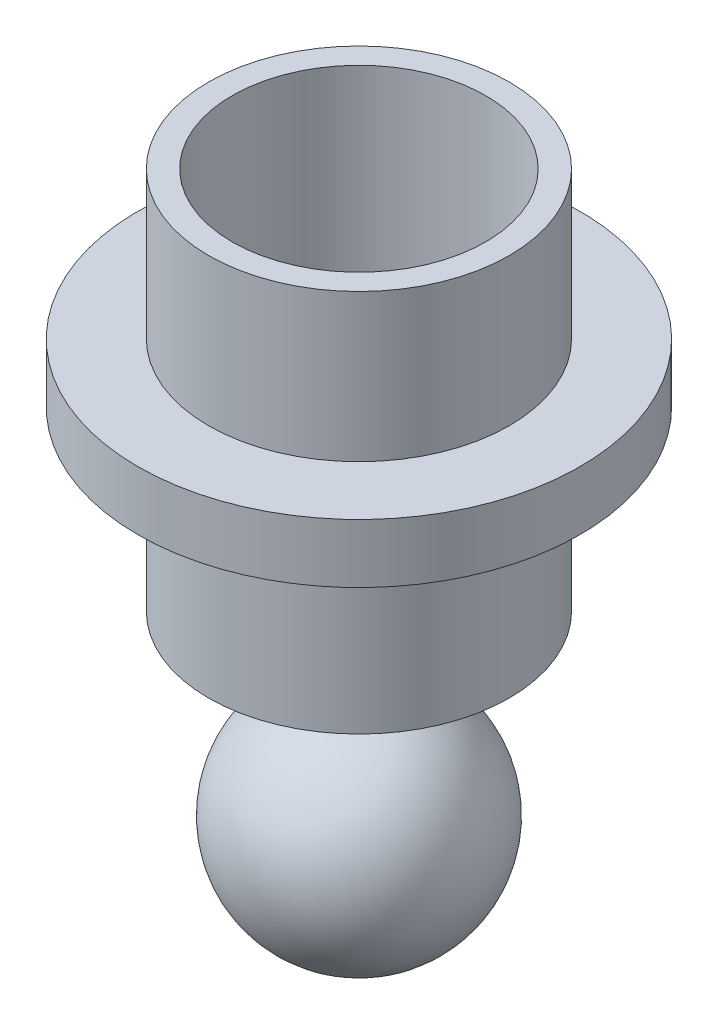
ISO-10303-21;
HEADER;
FILE_DESCRIPTION(('STEP AP214'),'2;1');
FILE_NAME('part.step','',(''),(''),'','','');
FILE_SCHEMA(('AUTOMOTIVE_DESIGN { 1 0 10303 214 1 1 1 1 }'));
ENDSEC;
DATA;
#1=APPLICATION_CONTEXT('core data for automotive mechanical design processes');
#2=APPLICATION_PROTOCOL_DEFINITION('international standard','automotive_design',2000,#1);
#3=PRODUCT_CONTEXT('',#1,'mechanical');
#4=PRODUCT('Part','Part','',(#3));
#5=PRODUCT_RELATED_PRODUCT_CATEGORY('part','',(#4));
#6=PRODUCT_DEFINITION_FORMATION('','',#4);
#7=PRODUCT_DEFINITION_CONTEXT('part definition',#1,'design');
#8=PRODUCT_DEFINITION('design','',#6,#7);
#9=PRODUCT_DEFINITION_SHAPE('','',#8);
#10=(LENGTH_UNIT() NAMED_UNIT(*) SI_UNIT(.MILLI.,.METRE.));
#11=(NAMED_UNIT(*) PLANE_ANGLE_UNIT() SI_UNIT($,.RADIAN.));
#12=(NAMED_UNIT(*) SI_UNIT($,.STERADIAN.) SOLID_ANGLE_UNIT());
#13=UNCERTAINTY_MEASURE_WITH_UNIT(LENGTH_MEASURE(1.E-05),#10,'distance_accuracy_value','');
#14=(GEOMETRIC_REPRESENTATION_CONTEXT(3) GLOBAL_UNCERTAINTY_ASSIGNED_CONTEXT((#13)) GLOBAL_UNIT_ASSIGNED_CONTEXT((#10,
#11,#12)) REPRESENTATION_CONTEXT('',''));
#15=CARTESIAN_POINT('',(0.,0.,0.));
#16=DIRECTION('',(0.,0.,1.));
#17=DIRECTION('',(1.,0.,0.));
#18=AXIS2_PLACEMENT_3D('',#15,#16,#17);
#19=CARTESIAN_POINT('',(0.,1.,0.));
#20=DIRECTION('',(0.,-1.,0.));
#21=DIRECTION('',(0.,0.,-1.));
#22=AXIS2_PLACEMENT_3D('',#19,#20,#21);
#23=CYLINDRICAL_SURFACE('',#22,5.1);
#24=CARTESIAN_POINT('',(0.,0.,0.));
#25=DIRECTION('',(0.,1.,0.));
#26=DIRECTION('',(0.,0.,1.));
#27=AXIS2_PLACEMENT_3D('',#24,#25,#26);
#28=CIRCLE('',#27,5.1);
#29=CARTESIAN_POINT('',(0.,0.,5.1));
#30=VERTEX_POINT('',#29);
#31=EDGE_CURVE('E478',#30,#30,#28,.T.);
#32=ORIENTED_EDGE('',*,*,#31,.T.);
#33=EDGE_LOOP('',(#32));
#34=FACE_BOUND('',#33,.T.);
#35=CARTESIAN_POINT('',(0.,6.,0.));
#36=DIRECTION('',(0.,1.,0.));
#37=DIRECTION('',(0.,0.,1.));
#38=AXIS2_PLACEMENT_3D('',#35,#36,#37);
#39=CIRCLE('',#38,5.1);
#40=CARTESIAN_POINT('',(0.,6.,5.1));
#41=VERTEX_POINT('',#40);
#42=EDGE_CURVE('E11',#41,#41,#39,.T.);
#43=ORIENTED_EDGE('',*,*,#42,.F.);
#44=EDGE_LOOP('',(#43));
#45=FACE_BOUND('',#44,.T.);
#46=ADVANCED_FACE('F47',(#34,#45),#23,.T.);
#47=CARTESIAN_POINT('',(0.,0.,0.));
#48=DIRECTION('',(0.,1.,0.));
#49=DIRECTION('',(0.,0.,1.));
#50=AXIS2_PLACEMENT_3D('',#47,#48,#49);
#51=PLANE('',#50);
#52=CARTESIAN_POINT('',(0.,0.,0.));
#53=DIRECTION('',(0.,1.,0.));
#54=DIRECTION('',(0.,0.,1.));
#55=AXIS2_PLACEMENT_3D('',#52,#53,#54);
#56=CIRCLE('',#55,1.5);
#57=CARTESIAN_POINT('',(0.,0.,1.5));
#58=VERTEX_POINT('',#57);
#59=EDGE_CURVE('E830',#58,#58,#56,.T.);
#60=ORIENTED_EDGE('',*,*,#59,.T.);
#61=EDGE_LOOP('',(#60));
#62=FACE_BOUND('',#61,.T.);
#63=CARTESIAN_POINT('',(0.,0.,0.));
#64=DIRECTION('',(0.,1.,0.));
#65=DIRECTION('',(0.,0.,1.));
#66=AXIS2_PLACEMENT_3D('',#63,#64,#65);
#67=CIRCLE('',#66,2.5);
#68=CARTESIAN_POINT('',(-2.41481456572267,0.,0.647047612756302));
#69=VERTEX_POINT('',#68);
#70=CARTESIAN_POINT('',(-1.76776695296637,0.,1.76776695296637));
#71=VERTEX_POINT('',#70);
#72=EDGE_CURVE('E369',#69,#71,#67,.T.);
#73=ORIENTED_EDGE('',*,*,#72,.F.);
#74=DIRECTION('',(0.965925826289068,0.,-0.258819045102521));
#75=VECTOR('',#74,1.);
#76=CARTESIAN_POINT('',(0.,0.,0.));
#77=LINE('',#76,#75);
#78=CARTESIAN_POINT('',(-3.18755522675393,0.,0.854102848838318));
#79=VERTEX_POINT('',#78);
#80=EDGE_CURVE('E385',#79,#69,#77,.T.);
#81=ORIENTED_EDGE('',*,*,#80,.F.);
#82=CARTESIAN_POINT('',(0.,0.,0.));
#83=DIRECTION('',(0.,1.,0.));
#84=DIRECTION('',(0.,0.,1.));
#85=AXIS2_PLACEMENT_3D('',#82,#83,#84);
#86=CIRCLE('',#85,3.3);
#87=CARTESIAN_POINT('',(-2.3334523779156,0.,2.33345237791561));
#88=VERTEX_POINT('',#87);
#89=EDGE_CURVE('E71',#79,#88,#86,.T.);
#90=ORIENTED_EDGE('',*,*,#89,.T.);
#91=DIRECTION('',(0.707106781186547,0.,-0.707106781186548));
#92=VECTOR('',#91,1.);
#93=CARTESIAN_POINT('',(0.,0.,0.));
#94=LINE('',#93,#92);
#95=EDGE_CURVE('E353',#88,#71,#94,.T.);
#96=ORIENTED_EDGE('',*,*,#95,.T.);
#97=EDGE_LOOP('',(#73,#81,#90,#96));
#98=FACE_BOUND('',#97,.T.);
#99=CARTESIAN_POINT('',(0.,0.,0.));
#100=DIRECTION('',(0.,1.,0.));
#101=DIRECTION('',(0.,0.,1.));
#102=AXIS2_PLACEMENT_3D('',#99,#100,#101);
#103=CIRCLE('',#102,2.5);
#104=CARTESIAN_POINT('',(1.76776695296637,0.,1.76776695296637));
#105=VERTEX_POINT('',#104);
#106=CARTESIAN_POINT('',(2.41481456572267,0.,0.647047612756299));
#107=VERTEX_POINT('',#106);
#108=EDGE_CURVE('E283',#105,#107,#103,.T.);
#109=ORIENTED_EDGE('',*,*,#108,.F.);
#110=DIRECTION('',(-0.707106781186548,0.,-0.707106781186547));
#111=VECTOR('',#110,1.);
#112=CARTESIAN_POINT('',(0.,0.,0.));
#113=LINE('',#112,#111);
#114=CARTESIAN_POINT('',(2.33345237791561,0.,2.33345237791561));
#115=VERTEX_POINT('',#114);
#116=EDGE_CURVE('E301',#115,#105,#113,.T.);
#117=ORIENTED_EDGE('',*,*,#116,.F.);
#118=CARTESIAN_POINT('',(0.,0.,0.));
#119=DIRECTION('',(0.,1.,0.));
#120=DIRECTION('',(0.,0.,1.));
#121=AXIS2_PLACEMENT_3D('',#118,#119,#120);
#122=CIRCLE('',#121,3.3);
#123=CARTESIAN_POINT('',(3.18755522675393,0.,0.854102848838315));
#124=VERTEX_POINT('',#123);
#125=EDGE_CURVE('E297',#115,#124,#122,.T.);
#126=ORIENTED_EDGE('',*,*,#125,.T.);
#127=DIRECTION('',(-0.965925826289069,0.,-0.258819045102519));
#128=VECTOR('',#127,1.);
#129=CARTESIAN_POINT('',(0.,0.,0.));
#130=LINE('',#129,#128);
#131=EDGE_CURVE('E267',#124,#107,#130,.T.);
#132=ORIENTED_EDGE('',*,*,#131,.T.);
#133=EDGE_LOOP('',(#109,#117,#126,#132));
#134=FACE_BOUND('',#133,.T.);
#135=CARTESIAN_POINT('',(0.,0.,0.));
#136=DIRECTION('',(0.,1.,0.));
#137=DIRECTION('',(0.,0.,1.));
#138=AXIS2_PLACEMENT_3D('',#135,#136,#137);
#139=CIRCLE('',#138,2.5);
#140=CARTESIAN_POINT('',(-1.76776695296637,0.,-1.76776695296637));
#141=VERTEX_POINT('',#140);
#142=CARTESIAN_POINT('',(-2.41481456572267,0.,-0.647047612756298));
#143=VERTEX_POINT('',#142);
#144=EDGE_CURVE('E432',#141,#143,#139,.T.);
#145=ORIENTED_EDGE('',*,*,#144,.F.);
#146=DIRECTION('',(0.707106781186548,0.,0.707106781186547));
#147=VECTOR('',#146,1.);
#148=CARTESIAN_POINT('',(0.,0.,0.));
#149=LINE('',#148,#147);
#150=CARTESIAN_POINT('',(-2.33345237791561,0.,-2.33345237791561));
#151=VERTEX_POINT('',#150);
#152=EDGE_CURVE('E435',#151,#141,#149,.T.);
#153=ORIENTED_EDGE('',*,*,#152,.F.);
#154=CARTESIAN_POINT('',(0.,0.,0.));
#155=DIRECTION('',(0.,1.,0.));
#156=DIRECTION('',(0.,0.,1.));
#157=AXIS2_PLACEMENT_3D('',#154,#155,#156);
#158=CIRCLE('',#157,3.3);
#159=CARTESIAN_POINT('',(-3.18755522675393,0.,-0.854102848838313));
#160=VERTEX_POINT('',#159);
#161=EDGE_CURVE('E439',#151,#160,#158,.T.);
#162=ORIENTED_EDGE('',*,*,#161,.T.);
#163=DIRECTION('',(0.965925826289069,0.,0.258819045102519));
#164=VECTOR('',#163,1.);
#165=CARTESIAN_POINT('',(0.,0.,0.));
#166=LINE('',#165,#164);
#167=EDGE_CURVE('E443',#160,#143,#166,.T.);
#168=ORIENTED_EDGE('',*,*,#167,.T.);
#169=EDGE_LOOP('',(#145,#153,#162,#168));
#170=FACE_BOUND('',#169,.T.);
#171=ORIENTED_EDGE('',*,*,#31,.F.);
#172=EDGE_LOOP('',(#171));
#173=FACE_BOUND('',#172,.T.);
#174=CARTESIAN_POINT('',(0.,0.,0.));
#175=DIRECTION('',(0.,1.,0.));
#176=DIRECTION('',(0.,0.,1.));
#177=AXIS2_PLACEMENT_3D('',#174,#175,#176);
#178=CIRCLE('',#177,2.5);
#179=CARTESIAN_POINT('',(2.41481456572267,0.,-0.647047612756301));
#180=VERTEX_POINT('',#179);
#181=CARTESIAN_POINT('',(1.76776695296637,0.,-1.76776695296637));
#182=VERTEX_POINT('',#181);
#183=EDGE_CURVE('E217',#180,#182,#178,.T.);
#184=ORIENTED_EDGE('',*,*,#183,.F.);
#185=DIRECTION('',(-0.965925826289068,0.,0.25881904510252));
#186=VECTOR('',#185,1.);
#187=CARTESIAN_POINT('',(0.,0.,0.));
#188=LINE('',#187,#186);
#189=CARTESIAN_POINT('',(3.18755522675393,0.,-0.854102848838317));
#190=VERTEX_POINT('',#189);
#191=EDGE_CURVE('E258',#190,#180,#188,.T.);
#192=ORIENTED_EDGE('',*,*,#191,.F.);
#193=CARTESIAN_POINT('',(0.,0.,0.));
#194=DIRECTION('',(0.,1.,0.));
#195=DIRECTION('',(0.,0.,1.));
#196=AXIS2_PLACEMENT_3D('',#193,#194,#195);
#197=CIRCLE('',#196,3.3);
#198=CARTESIAN_POINT('',(2.3334523779156,0.,-2.33345237791561));
#199=VERTEX_POINT('',#198);
#200=EDGE_CURVE('E253',#190,#199,#197,.T.);
#201=ORIENTED_EDGE('',*,*,#200,.T.);
#202=DIRECTION('',(-0.707106781186547,0.,0.707106781186548));
#203=VECTOR('',#202,1.);
#204=CARTESIAN_POINT('',(0.,0.,0.));
#205=LINE('',#204,#203);
#206=EDGE_CURVE('E250',#199,#182,#205,.T.);
#207=ORIENTED_EDGE('',*,*,#206,.T.);
#208=EDGE_LOOP('',(#184,#192,#201,#207));
#209=FACE_BOUND('',#208,.T.);
#210=CARTESIAN_POINT('',(0.,0.,0.));
#211=DIRECTION('',(0.,1.,0.));
#212=DIRECTION('',(0.,0.,1.));
#213=AXIS2_PLACEMENT_3D('',#210,#211,#212);
#214=CIRCLE('',#213,2.5);
#215=CARTESIAN_POINT('',(-0.647047612756303,0.,2.41481456572267));
#216=VERTEX_POINT('',#215);
#217=CARTESIAN_POINT('',(0.647047612756304,0.,2.41481456572267));
#218=VERTEX_POINT('',#217);
#219=EDGE_CURVE('E326',#216,#218,#214,.T.);
#220=ORIENTED_EDGE('',*,*,#219,.F.);
#221=DIRECTION('',(0.258819045102521,0.,-0.965925826289068));
#222=VECTOR('',#221,1.);
#223=CARTESIAN_POINT('',(0.,0.,0.));
#224=LINE('',#223,#222);
#225=CARTESIAN_POINT('',(-0.85410284883832,0.,3.18755522675393));
#226=VERTEX_POINT('',#225);
#227=EDGE_CURVE('E344',#226,#216,#224,.T.);
#228=ORIENTED_EDGE('',*,*,#227,.F.);
#229=CARTESIAN_POINT('',(0.,0.,0.));
#230=DIRECTION('',(0.,1.,0.));
#231=DIRECTION('',(0.,0.,1.));
#232=AXIS2_PLACEMENT_3D('',#229,#230,#231);
#233=CIRCLE('',#232,3.3);
#234=CARTESIAN_POINT('',(0.854102848838322,0.,3.18755522675392));
#235=VERTEX_POINT('',#234);
#236=EDGE_CURVE('E340',#226,#235,#233,.T.);
#237=ORIENTED_EDGE('',*,*,#236,.T.);
#238=DIRECTION('',(-0.258819045102522,0.,-0.965925826289068));
#239=VECTOR('',#238,1.);
#240=CARTESIAN_POINT('',(0.,0.,0.));
#241=LINE('',#240,#239);
#242=EDGE_CURVE('E310',#235,#218,#241,.T.);
#243=ORIENTED_EDGE('',*,*,#242,.T.);
#244=EDGE_LOOP('',(#220,#228,#237,#243));
#245=FACE_BOUND('',#244,.T.);
#246=DIRECTION('',(-0.258819045102521,0.,0.965925826289068));
#247=VECTOR('',#246,1.);
#248=CARTESIAN_POINT('',(0.854102848838321,0.,-3.18755522675393));
#249=LINE('',#248,#247);
#250=CARTESIAN_POINT('',(0.854102848838321,0.,-3.18755522675392));
#251=VERTEX_POINT('',#250);
#252=CARTESIAN_POINT('',(0.647047612756304,0.,-2.41481456572267));
#253=VERTEX_POINT('',#252);
#254=EDGE_CURVE('E411',#251,#253,#249,.T.);
#255=ORIENTED_EDGE('',*,*,#254,.F.);
#256=CARTESIAN_POINT('',(0.,0.,0.));
#257=DIRECTION('',(0.,1.,0.));
#258=DIRECTION('',(0.,0.,1.));
#259=AXIS2_PLACEMENT_3D('',#256,#257,#258);
#260=CIRCLE('',#259,3.3);
#261=CARTESIAN_POINT('',(-0.854102848838322,0.,-3.18755522675392));
#262=VERTEX_POINT('',#261);
#263=EDGE_CURVE('E405',#251,#262,#260,.T.);
#264=ORIENTED_EDGE('',*,*,#263,.T.);
#265=DIRECTION('',(0.258819045102522,0.,0.965925826289068));
#266=VECTOR('',#265,1.);
#267=CARTESIAN_POINT('',(-0.854102848838321,0.,-3.18755522675392));
#268=LINE('',#267,#266);
#269=CARTESIAN_POINT('',(-0.647047612756304,0.,-2.41481456572267));
#270=VERTEX_POINT('',#269);
#271=EDGE_CURVE('E63',#262,#270,#268,.T.);
#272=ORIENTED_EDGE('',*,*,#271,.T.);
#273=CARTESIAN_POINT('',(0.,0.,0.));
#274=DIRECTION('',(0.,1.,0.));
#275=DIRECTION('',(0.,0.,1.));
#276=AXIS2_PLACEMENT_3D('',#273,#274,#275);
#277=CIRCLE('',#276,2.5);
#278=EDGE_CURVE('E427',#253,#270,#277,.T.);
#279=ORIENTED_EDGE('',*,*,#278,.F.);
#280=EDGE_LOOP('',(#255,#264,#272,#279));
#281=FACE_BOUND('',#280,.T.);
#282=ADVANCED_FACE('F489',(#62,#98,#134,#170,#173,#209,#245,#281),#51,.F.);
#283=CARTESIAN_POINT('',(0.,1.,0.));
#284=DIRECTION('',(0.,1.,0.));
#285=DIRECTION('',(0.,0.,1.));
#286=AXIS2_PLACEMENT_3D('',#283,#284,#285);
#287=PLANE('',#286);
#288=CARTESIAN_POINT('',(0.,1.,0.));
#289=DIRECTION('',(0.,1.,0.));
#290=DIRECTION('',(0.,0.,1.));
#291=AXIS2_PLACEMENT_3D('',#288,#289,#290);
#292=CIRCLE('',#291,4.3);
#293=CARTESIAN_POINT('',(0.,1.,4.3));
#294=VERTEX_POINT('',#293);
#295=EDGE_CURVE('E56',#294,#294,#292,.F.);
#296=ORIENTED_EDGE('',*,*,#295,.F.);
#297=EDGE_LOOP('',(#296));
#298=FACE_BOUND('',#297,.T.);
#299=DIRECTION('',(0.707106781186548,0.,0.707106781186547));
#300=VECTOR('',#299,1.);
#301=CARTESIAN_POINT('',(0.,1.,0.));
#302=LINE('',#301,#300);
#303=CARTESIAN_POINT('',(-2.33345237791561,1.,-2.33345237791561));
#304=VERTEX_POINT('',#303);
#305=CARTESIAN_POINT('',(-1.76776695296637,1.,-1.76776695296637));
#306=VERTEX_POINT('',#305);
#307=EDGE_CURVE('E245',#304,#306,#302,.T.);
#308=ORIENTED_EDGE('',*,*,#307,.T.);
#309=CARTESIAN_POINT('',(0.,1.,0.));
#310=DIRECTION('',(0.,1.,0.));
#311=DIRECTION('',(0.,0.,1.));
#312=AXIS2_PLACEMENT_3D('',#309,#310,#311);
#313=CIRCLE('',#312,2.5);
#314=CARTESIAN_POINT('',(-2.41481456572267,1.,-0.647047612756298));
#315=VERTEX_POINT('',#314);
#316=EDGE_CURVE('E240',#306,#315,#313,.T.);
#317=ORIENTED_EDGE('',*,*,#316,.T.);
#318=DIRECTION('',(0.965925826289069,0.,0.258819045102519));
#319=VECTOR('',#318,1.);
#320=CARTESIAN_POINT('',(0.,1.,0.));
#321=LINE('',#320,#319);
#322=CARTESIAN_POINT('',(-3.18755522675393,1.,-0.854102848838313));
#323=VERTEX_POINT('',#322);
#324=EDGE_CURVE('E436',#323,#315,#321,.T.);
#325=ORIENTED_EDGE('',*,*,#324,.F.);
#326=CARTESIAN_POINT('',(0.,1.,0.));
#327=DIRECTION('',(0.,1.,0.));
#328=DIRECTION('',(0.,0.,1.));
#329=AXIS2_PLACEMENT_3D('',#326,#327,#328);
#330=CIRCLE('',#329,3.3);
#331=EDGE_CURVE('E451',#304,#323,#330,.T.);
#332=ORIENTED_EDGE('',*,*,#331,.F.);
#333=EDGE_LOOP('',(#308,#317,#325,#332));
#334=FACE_BOUND('',#333,.T.);
#335=DIRECTION('',(-0.965925826289068,0.,0.25881904510252));
#336=VECTOR('',#335,1.);
#337=CARTESIAN_POINT('',(0.,1.,0.));
#338=LINE('',#337,#336);
#339=CARTESIAN_POINT('',(3.18755522675393,1.,-0.854102848838317));
#340=VERTEX_POINT('',#339);
#341=CARTESIAN_POINT('',(2.41481456572267,1.,-0.6470476127563));
#342=VERTEX_POINT('',#341);
#343=EDGE_CURVE('E238',#340,#342,#338,.T.);
#344=ORIENTED_EDGE('',*,*,#343,.T.);
#345=CARTESIAN_POINT('',(0.,1.,0.));
#346=DIRECTION('',(0.,1.,0.));
#347=DIRECTION('',(0.,0.,1.));
#348=AXIS2_PLACEMENT_3D('',#345,#346,#347);
#349=CIRCLE('',#348,2.5);
#350=CARTESIAN_POINT('',(1.76776695296637,1.,-1.76776695296637));
#351=VERTEX_POINT('',#350);
#352=EDGE_CURVE('E214',#342,#351,#349,.T.);
#353=ORIENTED_EDGE('',*,*,#352,.T.);
#354=DIRECTION('',(-0.707106781186547,0.,0.707106781186548));
#355=VECTOR('',#354,1.);
#356=CARTESIAN_POINT('',(0.,1.,0.));
#357=LINE('',#356,#355);
#358=CARTESIAN_POINT('',(2.3334523779156,1.,-2.33345237791561));
#359=VERTEX_POINT('',#358);
#360=EDGE_CURVE('E226',#359,#351,#357,.T.);
#361=ORIENTED_EDGE('',*,*,#360,.F.);
#362=CARTESIAN_POINT('',(0.,1.,0.));
#363=DIRECTION('',(0.,1.,0.));
#364=DIRECTION('',(0.,0.,1.));
#365=AXIS2_PLACEMENT_3D('',#362,#363,#364);
#366=CIRCLE('',#365,3.3);
#367=EDGE_CURVE('E232',#340,#359,#366,.T.);
#368=ORIENTED_EDGE('',*,*,#367,.F.);
#369=EDGE_LOOP('',(#344,#353,#361,#368));
#370=FACE_BOUND('',#369,.T.);
#371=DIRECTION('',(-0.707106781186548,0.,-0.707106781186547));
#372=VECTOR('',#371,1.);
#373=CARTESIAN_POINT('',(0.,1.,0.));
#374=LINE('',#373,#372);
#375=CARTESIAN_POINT('',(2.33345237791561,1.,2.33345237791561));
#376=VERTEX_POINT('',#375);
#377=CARTESIAN_POINT('',(1.76776695296637,1.,1.76776695296637));
#378=VERTEX_POINT('',#377);
#379=EDGE_CURVE('E287',#376,#378,#374,.T.);
#380=ORIENTED_EDGE('',*,*,#379,.T.);
#381=CARTESIAN_POINT('',(0.,1.,0.));
#382=DIRECTION('',(0.,1.,0.));
#383=DIRECTION('',(0.,0.,1.));
#384=AXIS2_PLACEMENT_3D('',#381,#382,#383);
#385=CIRCLE('',#384,2.5);
#386=CARTESIAN_POINT('',(2.41481456572267,1.,0.647047612756299));
#387=VERTEX_POINT('',#386);
#388=EDGE_CURVE('E223',#378,#387,#385,.T.);
#389=ORIENTED_EDGE('',*,*,#388,.T.);
#390=DIRECTION('',(-0.965925826289069,0.,-0.258819045102519));
#391=VECTOR('',#390,1.);
#392=CARTESIAN_POINT('',(0.,1.,0.));
#393=LINE('',#392,#391);
#394=CARTESIAN_POINT('',(3.18755522675393,1.,0.854102848838315));
#395=VERTEX_POINT('',#394);
#396=EDGE_CURVE('E278',#395,#387,#393,.T.);
#397=ORIENTED_EDGE('',*,*,#396,.F.);
#398=CARTESIAN_POINT('',(0.,1.,0.));
#399=DIRECTION('',(0.,1.,0.));
#400=DIRECTION('',(0.,0.,1.));
#401=AXIS2_PLACEMENT_3D('',#398,#399,#400);
#402=CIRCLE('',#401,3.3);
#403=EDGE_CURVE('E282',#376,#395,#402,.T.);
#404=ORIENTED_EDGE('',*,*,#403,.F.);
#405=EDGE_LOOP('',(#380,#389,#397,#404));
#406=FACE_BOUND('',#405,.T.);
#407=DIRECTION('',(0.258819045102521,0.,-0.965925826289068));
#408=VECTOR('',#407,1.);
#409=CARTESIAN_POINT('',(0.,1.,0.));
#410=LINE('',#409,#408);
#411=CARTESIAN_POINT('',(-0.85410284883832,1.,3.18755522675393));
#412=VERTEX_POINT('',#411);
#413=CARTESIAN_POINT('',(-0.647047612756303,1.,2.41481456572267));
#414=VERTEX_POINT('',#413);
#415=EDGE_CURVE('E330',#412,#414,#410,.T.);
#416=ORIENTED_EDGE('',*,*,#415,.T.);
#417=CARTESIAN_POINT('',(0.,1.,0.));
#418=DIRECTION('',(0.,1.,0.));
#419=DIRECTION('',(0.,0.,1.));
#420=AXIS2_PLACEMENT_3D('',#417,#418,#419);
#421=CIRCLE('',#420,2.5);
#422=CARTESIAN_POINT('',(0.647047612756304,1.,2.41481456572267));
#423=VERTEX_POINT('',#422);
#424=EDGE_CURVE('E277',#414,#423,#421,.T.);
#425=ORIENTED_EDGE('',*,*,#424,.T.);
#426=DIRECTION('',(-0.258819045102522,0.,-0.965925826289068));
#427=VECTOR('',#426,1.);
#428=CARTESIAN_POINT('',(0.,1.,0.));
#429=LINE('',#428,#427);
#430=CARTESIAN_POINT('',(0.854102848838322,1.,3.18755522675392));
#431=VERTEX_POINT('',#430);
#432=EDGE_CURVE('E321',#431,#423,#429,.T.);
#433=ORIENTED_EDGE('',*,*,#432,.F.);
#434=CARTESIAN_POINT('',(0.,1.,0.));
#435=DIRECTION('',(0.,1.,0.));
#436=DIRECTION('',(0.,0.,1.));
#437=AXIS2_PLACEMENT_3D('',#434,#435,#436);
#438=CIRCLE('',#437,3.3);
#439=EDGE_CURVE('E325',#412,#431,#438,.T.);
#440=ORIENTED_EDGE('',*,*,#439,.F.);
#441=EDGE_LOOP('',(#416,#425,#433,#440));
#442=FACE_BOUND('',#441,.T.);
#443=DIRECTION('',(0.965925826289068,0.,-0.258819045102521));
#444=VECTOR('',#443,1.);
#445=CARTESIAN_POINT('',(0.,1.,0.));
#446=LINE('',#445,#444);
#447=CARTESIAN_POINT('',(-3.18755522675393,1.,0.854102848838318));
#448=VERTEX_POINT('',#447);
#449=CARTESIAN_POINT('',(-2.41481456572267,1.,0.647047612756302));
#450=VERTEX_POINT('',#449);
#451=EDGE_CURVE('E373',#448,#450,#446,.T.);
#452=ORIENTED_EDGE('',*,*,#451,.T.);
#453=CARTESIAN_POINT('',(0.,1.,0.));
#454=DIRECTION('',(0.,1.,0.));
#455=DIRECTION('',(0.,0.,1.));
#456=AXIS2_PLACEMENT_3D('',#453,#454,#455);
#457=CIRCLE('',#456,2.5);
#458=CARTESIAN_POINT('',(-1.76776695296637,1.,1.76776695296637));
#459=VERTEX_POINT('',#458);
#460=EDGE_CURVE('E320',#450,#459,#457,.T.);
#461=ORIENTED_EDGE('',*,*,#460,.T.);
#462=DIRECTION('',(0.707106781186547,0.,-0.707106781186548));
#463=VECTOR('',#462,1.);
#464=CARTESIAN_POINT('',(0.,1.,0.));
#465=LINE('',#464,#463);
#466=CARTESIAN_POINT('',(-2.3334523779156,1.,2.33345237791561));
#467=VERTEX_POINT('',#466);
#468=EDGE_CURVE('E364',#467,#459,#465,.T.);
#469=ORIENTED_EDGE('',*,*,#468,.F.);
#470=CARTESIAN_POINT('',(0.,1.,0.));
#471=DIRECTION('',(0.,1.,0.));
#472=DIRECTION('',(0.,0.,1.));
#473=AXIS2_PLACEMENT_3D('',#470,#471,#472);
#474=CIRCLE('',#473,3.3);
#475=EDGE_CURVE('E368',#448,#467,#474,.T.);
#476=ORIENTED_EDGE('',*,*,#475,.F.);
#477=EDGE_LOOP('',(#452,#461,#469,#476));
#478=FACE_BOUND('',#477,.T.);
#479=CARTESIAN_POINT('',(0.,1.,0.));
#480=DIRECTION('',(0.,1.,0.));
#481=DIRECTION('',(0.,0.,1.));
#482=AXIS2_PLACEMENT_3D('',#479,#480,#481);
#483=CIRCLE('',#482,3.3);
#484=CARTESIAN_POINT('',(0.854102848838321,1.,-3.18755522675392));
#485=VERTEX_POINT('',#484);
#486=CARTESIAN_POINT('',(-0.854102848838321,1.,-3.18755522675392));
#487=VERTEX_POINT('',#486);
#488=EDGE_CURVE('E406',#485,#487,#483,.T.);
#489=ORIENTED_EDGE('',*,*,#488,.F.);
#490=DIRECTION('',(-0.258819045102521,0.,0.965925826289068));
#491=VECTOR('',#490,1.);
#492=CARTESIAN_POINT('',(0.854102848838321,1.,-3.18755522675393));
#493=LINE('',#492,#491);
#494=CARTESIAN_POINT('',(0.647047612756304,1.,-2.41481456572267));
#495=VERTEX_POINT('',#494);
#496=EDGE_CURVE('E363',#485,#495,#493,.T.);
#497=ORIENTED_EDGE('',*,*,#496,.T.);
#498=CARTESIAN_POINT('',(0.,1.,0.));
#499=DIRECTION('',(0.,1.,0.));
#500=DIRECTION('',(0.,0.,1.));
#501=AXIS2_PLACEMENT_3D('',#498,#499,#500);
#502=CIRCLE('',#501,2.5);
#503=CARTESIAN_POINT('',(-0.647047612756304,1.,-2.41481456572267));
#504=VERTEX_POINT('',#503);
#505=EDGE_CURVE('E415',#495,#504,#502,.T.);
#506=ORIENTED_EDGE('',*,*,#505,.T.);
#507=DIRECTION('',(0.258819045102522,0.,0.965925826289068));
#508=VECTOR('',#507,1.);
#509=CARTESIAN_POINT('',(-0.854102848838321,1.,-3.18755522675392));
#510=LINE('',#509,#508);
#511=EDGE_CURVE('E410',#487,#504,#510,.T.);
#512=ORIENTED_EDGE('',*,*,#511,.F.);
#513=EDGE_LOOP('',(#489,#497,#506,#512));
#514=FACE_BOUND('',#513,.T.);
#515=ADVANCED_FACE('F235',(#298,#334,#370,#406,#442,#478,#514),#287,.T.);
#516=CARTESIAN_POINT('',(0.,8.,0.));
#517=DIRECTION('',(0.,1.,0.));
#518=DIRECTION('',(0.,0.,1.));
#519=AXIS2_PLACEMENT_3D('',#516,#517,#518);
#520=CIRCLE('',#519,5.1);
#521=CARTESIAN_POINT('',(0.,8.,5.1));
#522=VERTEX_POINT('',#521);
#523=EDGE_CURVE('E538',#522,#522,#520,.T.);
#524=ORIENTED_EDGE('',*,*,#523,.T.);
#525=EDGE_LOOP('',(#524));
#526=FACE_BOUND('',#525,.T.);
#527=CARTESIAN_POINT('',(0.,13.,0.));
#528=DIRECTION('',(0.,1.,0.));
#529=DIRECTION('',(0.,0.,1.));
#530=AXIS2_PLACEMENT_3D('',#527,#528,#529);
#531=CIRCLE('',#530,5.1);
#532=CARTESIAN_POINT('',(0.,13.,5.1));
#533=VERTEX_POINT('',#532);
#534=EDGE_CURVE('E474',#533,#533,#531,.T.);
#535=ORIENTED_EDGE('',*,*,#534,.F.);
#536=EDGE_LOOP('',(#535));
#537=FACE_BOUND('',#536,.T.);
#538=ADVANCED_FACE('F49',(#526,#537),#23,.T.);
#539=CARTESIAN_POINT('',(0.,13.,0.));
#540=DIRECTION('',(0.,-1.,0.));
#541=DIRECTION('',(0.,0.,-1.));
#542=AXIS2_PLACEMENT_3D('',#539,#540,#541);
#543=CYLINDRICAL_SURFACE('',#542,4.3);
#544=CARTESIAN_POINT('',(0.,13.,0.));
#545=DIRECTION('',(0.,1.,0.));
#546=DIRECTION('',(0.,0.,1.));
#547=AXIS2_PLACEMENT_3D('',#544,#545,#546);
#548=CIRCLE('',#547,4.3);
#549=CARTESIAN_POINT('',(0.,13.,4.3));
#550=VERTEX_POINT('',#549);
#551=EDGE_CURVE('E461',#550,#550,#548,.T.);
#552=ORIENTED_EDGE('',*,*,#551,.T.);
#553=EDGE_LOOP('',(#552));
#554=FACE_BOUND('',#553,.T.);
#555=ORIENTED_EDGE('',*,*,#295,.T.);
#556=EDGE_LOOP('',(#555));
#557=FACE_BOUND('',#556,.T.);
#558=ADVANCED_FACE('F485',(#554,#557),#543,.F.);
#559=CARTESIAN_POINT('',(0.,13.,0.));
#560=DIRECTION('',(0.,1.,0.));
#561=DIRECTION('',(0.,0.,1.));
#562=AXIS2_PLACEMENT_3D('',#559,#560,#561);
#563=PLANE('',#562);
#564=ORIENTED_EDGE('',*,*,#551,.F.);
#565=EDGE_LOOP('',(#564));
#566=FACE_BOUND('',#565,.T.);
#567=ORIENTED_EDGE('',*,*,#534,.T.);
#568=EDGE_LOOP('',(#567));
#569=FACE_BOUND('',#568,.T.);
#570=ADVANCED_FACE('F532',(#566,#569),#563,.T.);
#571=CARTESIAN_POINT('',(0.,0.,0.));
#572=DIRECTION('',(0.,1.,0.));
#573=DIRECTION('',(0.,0.,1.));
#574=AXIS2_PLACEMENT_3D('',#571,#572,#573);
#575=CYLINDRICAL_SURFACE('',#574,2.5);
#576=ORIENTED_EDGE('',*,*,#316,.F.);
#577=DIRECTION('',(0.,1.,0.));
#578=VECTOR('',#577,1.);
#579=CARTESIAN_POINT('',(-1.76776695296637,0.,-1.76776695296637));
#580=LINE('',#579,#578);
#581=EDGE_CURVE('E446',#141,#306,#580,.T.);
#582=ORIENTED_EDGE('',*,*,#581,.F.);
#583=ORIENTED_EDGE('',*,*,#144,.T.);
#584=DIRECTION('',(0.,1.,0.));
#585=VECTOR('',#584,1.);
#586=CARTESIAN_POINT('',(-2.41481456572267,0.,-0.647047612756298));
#587=LINE('',#586,#585);
#588=EDGE_CURVE('E458',#143,#315,#587,.T.);
#589=ORIENTED_EDGE('',*,*,#588,.T.);
#590=EDGE_LOOP('',(#576,#582,#583,#589));
#591=FACE_BOUND('',#590,.T.);
#592=ADVANCED_FACE('F501',(#591),#575,.T.);
#593=CARTESIAN_POINT('',(0.,0.,0.));
#594=DIRECTION('',(-0.258819045102519,0.,0.965925826289069));
#595=DIRECTION('',(0.965925826289069,0.,0.258819045102519));
#596=AXIS2_PLACEMENT_3D('',#593,#594,#595);
#597=PLANE('',#596);
#598=ORIENTED_EDGE('',*,*,#324,.T.);
#599=ORIENTED_EDGE('',*,*,#588,.F.);
#600=ORIENTED_EDGE('',*,*,#167,.F.);
#601=DIRECTION('',(0.,1.,0.));
#602=VECTOR('',#601,1.);
#603=CARTESIAN_POINT('',(-3.18755522675393,0.,-0.854102848838313));
#604=LINE('',#603,#602);
#605=EDGE_CURVE('E462',#160,#323,#604,.T.);
#606=ORIENTED_EDGE('',*,*,#605,.T.);
#607=EDGE_LOOP('',(#598,#599,#600,#606));
#608=FACE_BOUND('',#607,.T.);
#609=ADVANCED_FACE('F507',(#608),#597,.F.);
#610=CARTESIAN_POINT('',(0.,0.,0.));
#611=DIRECTION('',(0.,1.,0.));
#612=DIRECTION('',(0.,0.,1.));
#613=AXIS2_PLACEMENT_3D('',#610,#611,#612);
#614=CYLINDRICAL_SURFACE('',#613,3.3);
#615=ORIENTED_EDGE('',*,*,#331,.T.);
#616=ORIENTED_EDGE('',*,*,#605,.F.);
#617=ORIENTED_EDGE('',*,*,#161,.F.);
#618=DIRECTION('',(0.,1.,0.));
#619=VECTOR('',#618,1.);
#620=CARTESIAN_POINT('',(-2.33345237791561,0.,-2.33345237791561));
#621=LINE('',#620,#619);
#622=EDGE_CURVE('E465',#151,#304,#621,.T.);
#623=ORIENTED_EDGE('',*,*,#622,.T.);
#624=EDGE_LOOP('',(#615,#616,#617,#623));
#625=FACE_BOUND('',#624,.T.);
#626=ADVANCED_FACE('F509',(#625),#614,.F.);
#627=CARTESIAN_POINT('',(0.,0.,0.));
#628=DIRECTION('',(-0.707106781186547,0.,0.707106781186548));
#629=DIRECTION('',(0.707106781186548,0.,0.707106781186547));
#630=AXIS2_PLACEMENT_3D('',#627,#628,#629);
#631=PLANE('',#630);
#632=ORIENTED_EDGE('',*,*,#307,.F.);
#633=ORIENTED_EDGE('',*,*,#622,.F.);
#634=ORIENTED_EDGE('',*,*,#152,.T.);
#635=ORIENTED_EDGE('',*,*,#581,.T.);
#636=EDGE_LOOP('',(#632,#633,#634,#635));
#637=FACE_BOUND('',#636,.T.);
#638=ADVANCED_FACE('F496',(#637),#631,.T.);
#639=CARTESIAN_POINT('',(0.,0.,0.));
#640=DIRECTION('',(0.,1.,0.));
#641=DIRECTION('',(0.,0.,1.));
#642=AXIS2_PLACEMENT_3D('',#639,#640,#641);
#643=CYLINDRICAL_SURFACE('',#642,2.5);
#644=ORIENTED_EDGE('',*,*,#352,.F.);
#645=DIRECTION('',(0.,1.,0.));
#646=VECTOR('',#645,1.);
#647=CARTESIAN_POINT('',(2.41481456572267,0.,-0.647047612756301));
#648=LINE('',#647,#646);
#649=EDGE_CURVE('E254',#180,#342,#648,.T.);
#650=ORIENTED_EDGE('',*,*,#649,.F.);
#651=ORIENTED_EDGE('',*,*,#183,.T.);
#652=DIRECTION('',(0.,1.,0.));
#653=VECTOR('',#652,1.);
#654=CARTESIAN_POINT('',(1.76776695296637,0.,-1.76776695296637));
#655=LINE('',#654,#653);
#656=EDGE_CURVE('E209',#182,#351,#655,.T.);
#657=ORIENTED_EDGE('',*,*,#656,.T.);
#658=EDGE_LOOP('',(#644,#650,#651,#657));
#659=FACE_BOUND('',#658,.T.);
#660=ADVANCED_FACE('F211',(#659),#643,.T.);
#661=CARTESIAN_POINT('',(0.,0.,0.));
#662=DIRECTION('',(-0.707106781186548,0.,-0.707106781186547));
#663=DIRECTION('',(-0.707106781186547,0.,0.707106781186548));
#664=AXIS2_PLACEMENT_3D('',#661,#662,#663);
#665=PLANE('',#664);
#666=ORIENTED_EDGE('',*,*,#360,.T.);
#667=ORIENTED_EDGE('',*,*,#656,.F.);
#668=ORIENTED_EDGE('',*,*,#206,.F.);
#669=DIRECTION('',(0.,1.,0.));
#670=VECTOR('',#669,1.);
#671=CARTESIAN_POINT('',(2.3334523779156,0.,-2.33345237791561));
#672=LINE('',#671,#670);
#673=EDGE_CURVE('E222',#199,#359,#672,.T.);
#674=ORIENTED_EDGE('',*,*,#673,.T.);
#675=EDGE_LOOP('',(#666,#667,#668,#674));
#676=FACE_BOUND('',#675,.T.);
#677=ADVANCED_FACE('F227',(#676),#665,.F.);
#678=CARTESIAN_POINT('',(0.,0.,0.));
#679=DIRECTION('',(0.,1.,0.));
#680=DIRECTION('',(0.,0.,1.));
#681=AXIS2_PLACEMENT_3D('',#678,#679,#680);
#682=CYLINDRICAL_SURFACE('',#681,3.3);
#683=ORIENTED_EDGE('',*,*,#367,.T.);
#684=ORIENTED_EDGE('',*,*,#673,.F.);
#685=ORIENTED_EDGE('',*,*,#200,.F.);
#686=DIRECTION('',(0.,1.,0.));
#687=VECTOR('',#686,1.);
#688=CARTESIAN_POINT('',(3.18755522675393,0.,-0.854102848838317));
#689=LINE('',#688,#687);
#690=EDGE_CURVE('E847',#190,#340,#689,.T.);
#691=ORIENTED_EDGE('',*,*,#690,.T.);
#692=EDGE_LOOP('',(#683,#684,#685,#691));
#693=FACE_BOUND('',#692,.T.);
#694=ADVANCED_FACE('F587',(#693),#682,.F.);
#695=CARTESIAN_POINT('',(0.,0.,0.));
#696=DIRECTION('',(-0.25881904510252,0.,-0.965925826289069));
#697=DIRECTION('',(-0.965925826289069,0.,0.25881904510252));
#698=AXIS2_PLACEMENT_3D('',#695,#696,#697);
#699=PLANE('',#698);
#700=ORIENTED_EDGE('',*,*,#343,.F.);
#701=ORIENTED_EDGE('',*,*,#690,.F.);
#702=ORIENTED_EDGE('',*,*,#191,.T.);
#703=ORIENTED_EDGE('',*,*,#649,.T.);
#704=EDGE_LOOP('',(#700,#701,#702,#703));
#705=FACE_BOUND('',#704,.T.);
#706=ADVANCED_FACE('F596',(#705),#699,.T.);
#707=CARTESIAN_POINT('',(0.,0.,0.));
#708=DIRECTION('',(0.,1.,0.));
#709=DIRECTION('',(0.,0.,1.));
#710=AXIS2_PLACEMENT_3D('',#707,#708,#709);
#711=CYLINDRICAL_SURFACE('',#710,2.5);
#712=ORIENTED_EDGE('',*,*,#388,.F.);
#713=DIRECTION('',(0.,1.,0.));
#714=VECTOR('',#713,1.);
#715=CARTESIAN_POINT('',(1.76776695296637,0.,1.76776695296637));
#716=LINE('',#715,#714);
#717=EDGE_CURVE('E263',#105,#378,#716,.T.);
#718=ORIENTED_EDGE('',*,*,#717,.F.);
#719=ORIENTED_EDGE('',*,*,#108,.T.);
#720=DIRECTION('',(0.,1.,0.));
#721=VECTOR('',#720,1.);
#722=CARTESIAN_POINT('',(2.41481456572267,0.,0.647047612756299));
#723=LINE('',#722,#721);
#724=EDGE_CURVE('E274',#107,#387,#723,.T.);
#725=ORIENTED_EDGE('',*,*,#724,.T.);
#726=EDGE_LOOP('',(#712,#718,#719,#725));
#727=FACE_BOUND('',#726,.T.);
#728=ADVANCED_FACE('F606',(#727),#711,.T.);
#729=CARTESIAN_POINT('',(0.,0.,0.));
#730=DIRECTION('',(0.258819045102519,0.,-0.965925826289069));
#731=DIRECTION('',(-0.965925826289069,0.,-0.258819045102519));
#732=AXIS2_PLACEMENT_3D('',#729,#730,#731);
#733=PLANE('',#732);
#734=ORIENTED_EDGE('',*,*,#396,.T.);
#735=ORIENTED_EDGE('',*,*,#724,.F.);
#736=ORIENTED_EDGE('',*,*,#131,.F.);
#737=DIRECTION('',(0.,1.,0.));
#738=VECTOR('',#737,1.);
#739=CARTESIAN_POINT('',(3.18755522675393,0.,0.854102848838315));
#740=LINE('',#739,#738);
#741=EDGE_CURVE('E271',#124,#395,#740,.T.);
#742=ORIENTED_EDGE('',*,*,#741,.T.);
#743=EDGE_LOOP('',(#734,#735,#736,#742));
#744=FACE_BOUND('',#743,.T.);
#745=ADVANCED_FACE('F616',(#744),#733,.F.);
#746=CARTESIAN_POINT('',(0.,0.,0.));
#747=DIRECTION('',(0.,1.,0.));
#748=DIRECTION('',(0.,0.,1.));
#749=AXIS2_PLACEMENT_3D('',#746,#747,#748);
#750=CYLINDRICAL_SURFACE('',#749,3.3);
#751=ORIENTED_EDGE('',*,*,#403,.T.);
#752=ORIENTED_EDGE('',*,*,#741,.F.);
#753=ORIENTED_EDGE('',*,*,#125,.F.);
#754=DIRECTION('',(0.,1.,0.));
#755=VECTOR('',#754,1.);
#756=CARTESIAN_POINT('',(2.33345237791561,0.,2.33345237791561));
#757=LINE('',#756,#755);
#758=EDGE_CURVE('E268',#115,#376,#757,.T.);
#759=ORIENTED_EDGE('',*,*,#758,.T.);
#760=EDGE_LOOP('',(#751,#752,#753,#759));
#761=FACE_BOUND('',#760,.T.);
#762=ADVANCED_FACE('F626',(#761),#750,.F.);
#763=CARTESIAN_POINT('',(0.,0.,0.));
#764=DIRECTION('',(0.707106781186547,0.,-0.707106781186548));
#765=DIRECTION('',(-0.707106781186548,0.,-0.707106781186547));
#766=AXIS2_PLACEMENT_3D('',#763,#764,#765);
#767=PLANE('',#766);
#768=ORIENTED_EDGE('',*,*,#379,.F.);
#769=ORIENTED_EDGE('',*,*,#758,.F.);
#770=ORIENTED_EDGE('',*,*,#116,.T.);
#771=ORIENTED_EDGE('',*,*,#717,.T.);
#772=EDGE_LOOP('',(#768,#769,#770,#771));
#773=FACE_BOUND('',#772,.T.);
#774=ADVANCED_FACE('F636',(#773),#767,.T.);
#775=CARTESIAN_POINT('',(0.,0.,0.));
#776=DIRECTION('',(0.,1.,0.));
#777=DIRECTION('',(0.,0.,1.));
#778=AXIS2_PLACEMENT_3D('',#775,#776,#777);
#779=CYLINDRICAL_SURFACE('',#778,2.5);
#780=ORIENTED_EDGE('',*,*,#424,.F.);
#781=DIRECTION('',(0.,1.,0.));
#782=VECTOR('',#781,1.);
#783=CARTESIAN_POINT('',(-0.647047612756303,0.,2.41481456572267));
#784=LINE('',#783,#782);
#785=EDGE_CURVE('E306',#216,#414,#784,.T.);
#786=ORIENTED_EDGE('',*,*,#785,.F.);
#787=ORIENTED_EDGE('',*,*,#219,.T.);
#788=DIRECTION('',(0.,1.,0.));
#789=VECTOR('',#788,1.);
#790=CARTESIAN_POINT('',(0.647047612756304,0.,2.41481456572267));
#791=LINE('',#790,#789);
#792=EDGE_CURVE('E317',#218,#423,#791,.T.);
#793=ORIENTED_EDGE('',*,*,#792,.T.);
#794=EDGE_LOOP('',(#780,#786,#787,#793));
#795=FACE_BOUND('',#794,.T.);
#796=ADVANCED_FACE('F646',(#795),#779,.T.);
#797=CARTESIAN_POINT('',(0.,0.,0.));
#798=DIRECTION('',(0.965925826289068,0.,-0.258819045102522));
#799=DIRECTION('',(-0.258819045102522,0.,-0.965925826289068));
#800=AXIS2_PLACEMENT_3D('',#797,#798,#799);
#801=PLANE('',#800);
#802=ORIENTED_EDGE('',*,*,#432,.T.);
#803=ORIENTED_EDGE('',*,*,#792,.F.);
#804=ORIENTED_EDGE('',*,*,#242,.F.);
#805=DIRECTION('',(0.,1.,0.));
#806=VECTOR('',#805,1.);
#807=CARTESIAN_POINT('',(0.854102848838322,0.,3.18755522675392));
#808=LINE('',#807,#806);
#809=EDGE_CURVE('E314',#235,#431,#808,.T.);
#810=ORIENTED_EDGE('',*,*,#809,.T.);
#811=EDGE_LOOP('',(#802,#803,#804,#810));
#812=FACE_BOUND('',#811,.T.);
#813=ADVANCED_FACE('F656',(#812),#801,.F.);
#814=CARTESIAN_POINT('',(0.,0.,0.));
#815=DIRECTION('',(0.,1.,0.));
#816=DIRECTION('',(0.,0.,1.));
#817=AXIS2_PLACEMENT_3D('',#814,#815,#816);
#818=CYLINDRICAL_SURFACE('',#817,3.3);
#819=ORIENTED_EDGE('',*,*,#439,.T.);
#820=ORIENTED_EDGE('',*,*,#809,.F.);
#821=ORIENTED_EDGE('',*,*,#236,.F.);
#822=DIRECTION('',(0.,1.,0.));
#823=VECTOR('',#822,1.);
#824=CARTESIAN_POINT('',(-0.85410284883832,0.,3.18755522675393));
#825=LINE('',#824,#823);
#826=EDGE_CURVE('E311',#226,#412,#825,.T.);
#827=ORIENTED_EDGE('',*,*,#826,.T.);
#828=EDGE_LOOP('',(#819,#820,#821,#827));
#829=FACE_BOUND('',#828,.T.);
#830=ADVANCED_FACE('F666',(#829),#818,.F.);
#831=CARTESIAN_POINT('',(0.,0.,0.));
#832=DIRECTION('',(0.965925826289068,0.,0.258819045102521));
#833=DIRECTION('',(0.258819045102521,0.,-0.965925826289068));
#834=AXIS2_PLACEMENT_3D('',#831,#832,#833);
#835=PLANE('',#834);
#836=ORIENTED_EDGE('',*,*,#415,.F.);
#837=ORIENTED_EDGE('',*,*,#826,.F.);
#838=ORIENTED_EDGE('',*,*,#227,.T.);
#839=ORIENTED_EDGE('',*,*,#785,.T.);
#840=EDGE_LOOP('',(#836,#837,#838,#839));
#841=FACE_BOUND('',#840,.T.);
#842=ADVANCED_FACE('F676',(#841),#835,.T.);
#843=CARTESIAN_POINT('',(0.,0.,0.));
#844=DIRECTION('',(0.,1.,0.));
#845=DIRECTION('',(0.,0.,1.));
#846=AXIS2_PLACEMENT_3D('',#843,#844,#845);
#847=CYLINDRICAL_SURFACE('',#846,2.5);
#848=ORIENTED_EDGE('',*,*,#460,.F.);
#849=DIRECTION('',(0.,1.,0.));
#850=VECTOR('',#849,1.);
#851=CARTESIAN_POINT('',(-2.41481456572267,0.,0.647047612756302));
#852=LINE('',#851,#850);
#853=EDGE_CURVE('E349',#69,#450,#852,.T.);
#854=ORIENTED_EDGE('',*,*,#853,.F.);
#855=ORIENTED_EDGE('',*,*,#72,.T.);
#856=DIRECTION('',(0.,1.,0.));
#857=VECTOR('',#856,1.);
#858=CARTESIAN_POINT('',(-1.76776695296637,0.,1.76776695296637));
#859=LINE('',#858,#857);
#860=EDGE_CURVE('E360',#71,#459,#859,.T.);
#861=ORIENTED_EDGE('',*,*,#860,.T.);
#862=EDGE_LOOP('',(#848,#854,#855,#861));
#863=FACE_BOUND('',#862,.T.);
#864=ADVANCED_FACE('F686',(#863),#847,.T.);
#865=CARTESIAN_POINT('',(0.,0.,0.));
#866=DIRECTION('',(0.707106781186548,0.,0.707106781186547));
#867=DIRECTION('',(0.707106781186547,0.,-0.707106781186548));
#868=AXIS2_PLACEMENT_3D('',#865,#866,#867);
#869=PLANE('',#868);
#870=ORIENTED_EDGE('',*,*,#468,.T.);
#871=ORIENTED_EDGE('',*,*,#860,.F.);
#872=ORIENTED_EDGE('',*,*,#95,.F.);
#873=DIRECTION('',(0.,1.,0.));
#874=VECTOR('',#873,1.);
#875=CARTESIAN_POINT('',(-2.3334523779156,0.,2.33345237791561));
#876=LINE('',#875,#874);
#877=EDGE_CURVE('E357',#88,#467,#876,.T.);
#878=ORIENTED_EDGE('',*,*,#877,.T.);
#879=EDGE_LOOP('',(#870,#871,#872,#878));
#880=FACE_BOUND('',#879,.T.);
#881=ADVANCED_FACE('F696',(#880),#869,.F.);
#882=CARTESIAN_POINT('',(0.,0.,0.));
#883=DIRECTION('',(0.,1.,0.));
#884=DIRECTION('',(0.,0.,1.));
#885=AXIS2_PLACEMENT_3D('',#882,#883,#884);
#886=CYLINDRICAL_SURFACE('',#885,3.3);
#887=ORIENTED_EDGE('',*,*,#475,.T.);
#888=ORIENTED_EDGE('',*,*,#877,.F.);
#889=ORIENTED_EDGE('',*,*,#89,.F.);
#890=DIRECTION('',(0.,1.,0.));
#891=VECTOR('',#890,1.);
#892=CARTESIAN_POINT('',(-3.18755522675393,0.,0.854102848838318));
#893=LINE('',#892,#891);
#894=EDGE_CURVE('E354',#79,#448,#893,.T.);
#895=ORIENTED_EDGE('',*,*,#894,.T.);
#896=EDGE_LOOP('',(#887,#888,#889,#895));
#897=FACE_BOUND('',#896,.T.);
#898=ADVANCED_FACE('F706',(#897),#886,.F.);
#899=CARTESIAN_POINT('',(0.,0.,0.));
#900=DIRECTION('',(0.258819045102521,0.,0.965925826289068));
#901=DIRECTION('',(0.965925826289068,0.,-0.258819045102521));
#902=AXIS2_PLACEMENT_3D('',#899,#900,#901);
#903=PLANE('',#902);
#904=ORIENTED_EDGE('',*,*,#451,.F.);
#905=ORIENTED_EDGE('',*,*,#894,.F.);
#906=ORIENTED_EDGE('',*,*,#80,.T.);
#907=ORIENTED_EDGE('',*,*,#853,.T.);
#908=EDGE_LOOP('',(#904,#905,#906,#907));
#909=FACE_BOUND('',#908,.T.);
#910=ADVANCED_FACE('F716',(#909),#903,.T.);
#911=CARTESIAN_POINT('',(0.854102848838321,0.,-3.18755522675393));
#912=DIRECTION('',(-0.965925826289068,0.,-0.258819045102521));
#913=DIRECTION('',(-0.258819045102521,0.,0.965925826289068));
#914=AXIS2_PLACEMENT_3D('',#911,#912,#913);
#915=PLANE('',#914);
#916=ORIENTED_EDGE('',*,*,#496,.F.);
#917=DIRECTION('',(0.,1.,0.));
#918=VECTOR('',#917,1.);
#919=CARTESIAN_POINT('',(0.854102848838321,0.,-3.18755522675392));
#920=LINE('',#919,#918);
#921=EDGE_CURVE('E401',#251,#485,#920,.T.);
#922=ORIENTED_EDGE('',*,*,#921,.F.);
#923=ORIENTED_EDGE('',*,*,#254,.T.);
#924=DIRECTION('',(0.,1.,0.));
#925=VECTOR('',#924,1.);
#926=CARTESIAN_POINT('',(0.647047612756304,0.,-2.41481456572267));
#927=LINE('',#926,#925);
#928=EDGE_CURVE('E390',#253,#495,#927,.T.);
#929=ORIENTED_EDGE('',*,*,#928,.T.);
#930=EDGE_LOOP('',(#916,#922,#923,#929));
#931=FACE_BOUND('',#930,.T.);
#932=ADVANCED_FACE('F725',(#931),#915,.T.);
#933=CARTESIAN_POINT('',(0.,0.,0.));
#934=DIRECTION('',(0.,1.,0.));
#935=DIRECTION('',(0.,0.,1.));
#936=AXIS2_PLACEMENT_3D('',#933,#934,#935);
#937=CYLINDRICAL_SURFACE('',#936,2.5);
#938=ORIENTED_EDGE('',*,*,#505,.F.);
#939=ORIENTED_EDGE('',*,*,#928,.F.);
#940=ORIENTED_EDGE('',*,*,#278,.T.);
#941=DIRECTION('',(0.,1.,0.));
#942=VECTOR('',#941,1.);
#943=CARTESIAN_POINT('',(-0.647047612756304,0.,-2.41481456572267));
#944=LINE('',#943,#942);
#945=EDGE_CURVE('E394',#270,#504,#944,.T.);
#946=ORIENTED_EDGE('',*,*,#945,.T.);
#947=EDGE_LOOP('',(#938,#939,#940,#946));
#948=FACE_BOUND('',#947,.T.);
#949=ADVANCED_FACE('F735',(#948),#937,.T.);
#950=CARTESIAN_POINT('',(-0.854102848838321,0.,-3.18755522675392));
#951=DIRECTION('',(-0.965925826289068,0.,0.258819045102522));
#952=DIRECTION('',(0.258819045102522,0.,0.965925826289068));
#953=AXIS2_PLACEMENT_3D('',#950,#951,#952);
#954=PLANE('',#953);
#955=ORIENTED_EDGE('',*,*,#511,.T.);
#956=ORIENTED_EDGE('',*,*,#945,.F.);
#957=ORIENTED_EDGE('',*,*,#271,.F.);
#958=DIRECTION('',(0.,1.,0.));
#959=VECTOR('',#958,1.);
#960=CARTESIAN_POINT('',(-0.854102848838321,0.,-3.18755522675392));
#961=LINE('',#960,#959);
#962=EDGE_CURVE('E398',#262,#487,#961,.T.);
#963=ORIENTED_EDGE('',*,*,#962,.T.);
#964=EDGE_LOOP('',(#955,#956,#957,#963));
#965=FACE_BOUND('',#964,.T.);
#966=ADVANCED_FACE('F745',(#965),#954,.F.);
#967=CARTESIAN_POINT('',(0.,0.,0.));
#968=DIRECTION('',(0.,1.,0.));
#969=DIRECTION('',(0.,0.,1.));
#970=AXIS2_PLACEMENT_3D('',#967,#968,#969);
#971=CYLINDRICAL_SURFACE('',#970,3.3);
#972=ORIENTED_EDGE('',*,*,#488,.T.);
#973=ORIENTED_EDGE('',*,*,#962,.F.);
#974=ORIENTED_EDGE('',*,*,#263,.F.);
#975=ORIENTED_EDGE('',*,*,#921,.T.);
#976=EDGE_LOOP('',(#972,#973,#974,#975));
#977=FACE_BOUND('',#976,.T.);
#978=ADVANCED_FACE('F755',(#977),#971,.F.);
#979=CARTESIAN_POINT('',(0.,8.,0.));
#980=DIRECTION('',(0.,1.,0.));
#981=DIRECTION('',(0.,0.,1.));
#982=AXIS2_PLACEMENT_3D('',#979,#980,#981);
#983=PLANE('',#982);
#984=CARTESIAN_POINT('',(0.,8.,0.));
#985=DIRECTION('',(0.,1.,0.));
#986=DIRECTION('',(0.,0.,1.));
#987=AXIS2_PLACEMENT_3D('',#984,#985,#986);
#988=CIRCLE('',#987,7.5);
#989=CARTESIAN_POINT('',(0.,8.,7.5));
#990=VERTEX_POINT('',#989);
#991=EDGE_CURVE('E395',#990,#990,#988,.T.);
#992=ORIENTED_EDGE('',*,*,#991,.T.);
#993=EDGE_LOOP('',(#992));
#994=FACE_BOUND('',#993,.T.);
#995=ORIENTED_EDGE('',*,*,#523,.F.);
#996=EDGE_LOOP('',(#995));
#997=FACE_BOUND('',#996,.T.);
#998=ADVANCED_FACE('F763',(#994,#997),#983,.T.);
#999=CARTESIAN_POINT('',(0.,6.,0.));
#1000=DIRECTION('',(0.,1.,0.));
#1001=DIRECTION('',(0.,0.,1.));
#1002=AXIS2_PLACEMENT_3D('',#999,#1000,#1001);
#1003=PLANE('',#1002);
#1004=CARTESIAN_POINT('',(0.,6.,0.));
#1005=DIRECTION('',(0.,1.,0.));
#1006=DIRECTION('',(0.,0.,1.));
#1007=AXIS2_PLACEMENT_3D('',#1004,#1005,#1006);
#1008=CIRCLE('',#1007,7.5);
#1009=CARTESIAN_POINT('',(0.,6.,7.5));
#1010=VERTEX_POINT('',#1009);
#1011=EDGE_CURVE('E838',#1010,#1010,#1008,.T.);
#1012=ORIENTED_EDGE('',*,*,#1011,.F.);
#1013=EDGE_LOOP('',(#1012));
#1014=FACE_BOUND('',#1013,.T.);
#1015=ORIENTED_EDGE('',*,*,#42,.T.);
#1016=EDGE_LOOP('',(#1015));
#1017=FACE_BOUND('',#1016,.T.);
#1018=ADVANCED_FACE('F782',(#1014,#1017),#1003,.F.);
#1019=CARTESIAN_POINT('',(0.,8.,0.));
#1020=DIRECTION('',(0.,-1.,0.));
#1021=DIRECTION('',(0.,0.,-1.));
#1022=AXIS2_PLACEMENT_3D('',#1019,#1020,#1021);
#1023=CYLINDRICAL_SURFACE('',#1022,7.5);
#1024=ORIENTED_EDGE('',*,*,#991,.F.);
#1025=EDGE_LOOP('',(#1024));
#1026=FACE_BOUND('',#1025,.T.);
#1027=ORIENTED_EDGE('',*,*,#1011,.T.);
#1028=EDGE_LOOP('',(#1027));
#1029=FACE_BOUND('',#1028,.T.);
#1030=ADVANCED_FACE('F792',(#1026,#1029),#1023,.T.);
#1031=CARTESIAN_POINT('',(0.,-2.1,0.));
#1032=DIRECTION('',(0.,1.,0.));
#1033=DIRECTION('',(0.,0.,1.));
#1034=AXIS2_PLACEMENT_3D('',#1031,#1032,#1033);
#1035=CYLINDRICAL_SURFACE('',#1034,1.5);
#1036=ORIENTED_EDGE('',*,*,#59,.F.);
#1037=EDGE_LOOP('',(#1036));
#1038=FACE_BOUND('',#1037,.T.);
#1039=CARTESIAN_POINT('',(0.,-2.4,0.));
#1040=DIRECTION('',(0.,1.,0.));
#1041=DIRECTION('',(0.,0.,1.));
#1042=AXIS2_PLACEMENT_3D('',#1039,#1040,#1041);
#1043=CIRCLE('',#1042,1.5);
#1044=CARTESIAN_POINT('',(0.,-2.4,1.5));
#1045=VERTEX_POINT('',#1044);
#1046=EDGE_CURVE('E827',#1045,#1045,#1043,.T.);
#1047=ORIENTED_EDGE('',*,*,#1046,.T.);
#1048=EDGE_LOOP('',(#1047));
#1049=FACE_BOUND('',#1048,.T.);
#1050=ADVANCED_FACE('F802',(#1038,#1049),#1035,.T.);
#1051=CARTESIAN_POINT('',(0.,-6.,0.));
#1052=DIRECTION('',(0.,1.,0.));
#1053=DIRECTION('',(0.,0.,1.));
#1054=AXIS2_PLACEMENT_3D('',#1051,#1052,#1053);
#1055=SPHERICAL_SURFACE('',#1054,3.9);
#1056=ORIENTED_EDGE('',*,*,#1046,.F.);
#1057=EDGE_LOOP('',(#1056));
#1058=FACE_BOUND('',#1057,.T.);
#1059=ADVANCED_FACE('F812',(#1058),#1055,.T.);
#1060=CLOSED_SHELL('',(#46,#282,#515,#538,#558,#570,#592,#609,#626,#638,#660,#677,#694,#706,
#728,#745,#762,#774,#796,#813,#830,#842,#864,#881,#898,#910,#932,#949,#966,#978,#998,#1018,
#1030,#1050,#1059));
#1061=MANIFOLD_SOLID_BREP('B2',#1060);
#1062=ADVANCED_BREP_SHAPE_REPRESENTATION('',(#18,#1061),#14);
#1063=SHAPE_DEFINITION_REPRESENTATION(#9,#1062);
ENDSEC;
END-ISO-10303-21;
